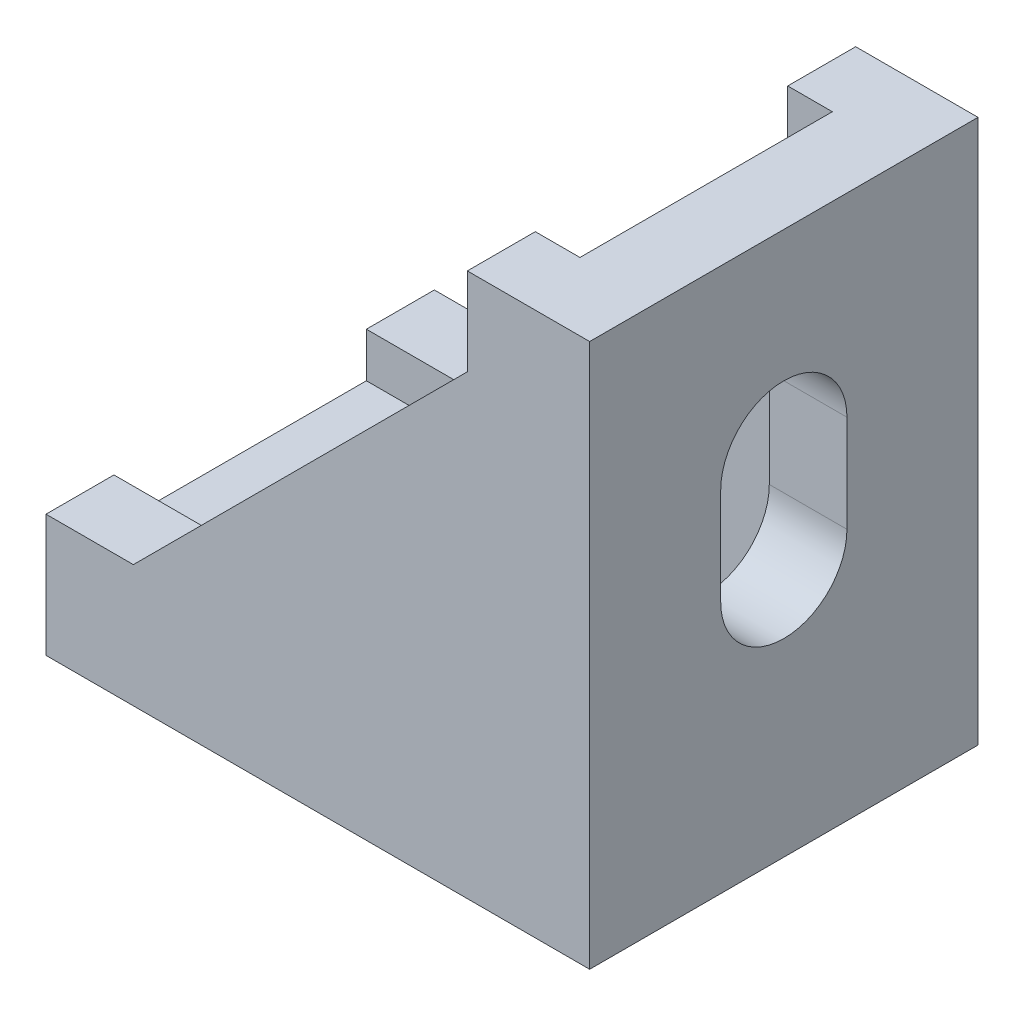
ISO-10303-21;
HEADER;
FILE_DESCRIPTION(('STEP AP214'),'2;1');
FILE_NAME('part.step','',(''),(''),'','','');
FILE_SCHEMA(('AUTOMOTIVE_DESIGN { 1 0 10303 214 1 1 1 1 }'));
ENDSEC;
DATA;
#1=APPLICATION_CONTEXT('core data for automotive mechanical design processes');
#2=APPLICATION_PROTOCOL_DEFINITION('international standard','automotive_design',2000,#1);
#3=PRODUCT_CONTEXT('',#1,'mechanical');
#4=PRODUCT('Part','Part','',(#3));
#5=PRODUCT_RELATED_PRODUCT_CATEGORY('part','',(#4));
#6=PRODUCT_DEFINITION_FORMATION('','',#4);
#7=PRODUCT_DEFINITION_CONTEXT('part definition',#1,'design');
#8=PRODUCT_DEFINITION('design','',#6,#7);
#9=PRODUCT_DEFINITION_SHAPE('','',#8);
#10=(LENGTH_UNIT() NAMED_UNIT(*) SI_UNIT(.MILLI.,.METRE.));
#11=(NAMED_UNIT(*) PLANE_ANGLE_UNIT() SI_UNIT($,.RADIAN.));
#12=(NAMED_UNIT(*) SI_UNIT($,.STERADIAN.) SOLID_ANGLE_UNIT());
#13=UNCERTAINTY_MEASURE_WITH_UNIT(LENGTH_MEASURE(1.E-05),#10,'distance_accuracy_value','');
#14=(GEOMETRIC_REPRESENTATION_CONTEXT(3) GLOBAL_UNCERTAINTY_ASSIGNED_CONTEXT((#13)) GLOBAL_UNIT_ASSIGNED_CONTEXT((#10,
#11,#12)) REPRESENTATION_CONTEXT('',''));
#15=CARTESIAN_POINT('',(0.,0.,0.));
#16=DIRECTION('',(0.,0.,1.));
#17=DIRECTION('',(1.,0.,0.));
#18=AXIS2_PLACEMENT_3D('',#15,#16,#17);
#19=CARTESIAN_POINT('',(10.,14.,20.));
#20=DIRECTION('',(1.,0.,0.));
#21=DIRECTION('',(0.,1.,0.));
#22=AXIS2_PLACEMENT_3D('',#19,#20,#21);
#23=PLANE('',#22);
#24=DIRECTION('',(0.,-1.,0.));
#25=VECTOR('',#24,1.);
#26=CARTESIAN_POINT('',(10.,4.00000000000001,6.75));
#27=LINE('',#26,#25);
#28=CARTESIAN_POINT('',(10.,4.00000000000001,6.75));
#29=VERTEX_POINT('',#28);
#30=CARTESIAN_POINT('',(10.,-0.999999999999995,6.75));
#31=VERTEX_POINT('',#30);
#32=EDGE_CURVE('E257',#29,#31,#27,.T.);
#33=ORIENTED_EDGE('',*,*,#32,.F.);
#34=CARTESIAN_POINT('',(10.,4.,10.));
#35=DIRECTION('',(-1.,0.,0.));
#36=DIRECTION('',(0.,-1.,0.));
#37=AXIS2_PLACEMENT_3D('',#34,#35,#36);
#38=CIRCLE('',#37,3.25);
#39=CARTESIAN_POINT('',(10.,4.,13.25));
#40=VERTEX_POINT('',#39);
#41=EDGE_CURVE('E231',#40,#29,#38,.T.);
#42=ORIENTED_EDGE('',*,*,#41,.F.);
#43=DIRECTION('',(0.,1.,0.));
#44=VECTOR('',#43,1.);
#45=CARTESIAN_POINT('',(10.,4.,13.25));
#46=LINE('',#45,#44);
#47=CARTESIAN_POINT('',(10.,-0.999999999999995,13.25));
#48=VERTEX_POINT('',#47);
#49=EDGE_CURVE('E242',#48,#40,#46,.T.);
#50=ORIENTED_EDGE('',*,*,#49,.F.);
#51=CARTESIAN_POINT('',(10.,-0.999999999999996,10.));
#52=DIRECTION('',(-1.,0.,0.));
#53=DIRECTION('',(0.,-1.,0.));
#54=AXIS2_PLACEMENT_3D('',#51,#52,#53);
#55=CIRCLE('',#54,3.25);
#56=EDGE_CURVE('E261',#31,#48,#55,.T.);
#57=ORIENTED_EDGE('',*,*,#56,.F.);
#58=EDGE_LOOP('',(#33,#42,#50,#57));
#59=FACE_BOUND('',#58,.T.);
#60=DIRECTION('',(0.,-1.,0.));
#61=VECTOR('',#60,1.);
#62=CARTESIAN_POINT('',(10.,14.,16.5));
#63=LINE('',#62,#61);
#64=CARTESIAN_POINT('',(10.,14.,16.5));
#65=VERTEX_POINT('',#64);
#66=CARTESIAN_POINT('',(10.,-10.,16.5));
#67=VERTEX_POINT('',#66);
#68=EDGE_CURVE('E325',#65,#67,#63,.T.);
#69=ORIENTED_EDGE('',*,*,#68,.F.);
#70=DIRECTION('',(0.,0.,-1.));
#71=VECTOR('',#70,1.);
#72=CARTESIAN_POINT('',(10.,14.,20.));
#73=LINE('',#72,#71);
#74=CARTESIAN_POINT('',(10.,14.,3.5));
#75=VERTEX_POINT('',#74);
#76=EDGE_CURVE('E48',#65,#75,#73,.T.);
#77=ORIENTED_EDGE('',*,*,#76,.T.);
#78=DIRECTION('',(0.,1.,0.));
#79=VECTOR('',#78,1.);
#80=CARTESIAN_POINT('',(10.,14.,3.5));
#81=LINE('',#80,#79);
#82=CARTESIAN_POINT('',(10.,-10.,3.5));
#83=VERTEX_POINT('',#82);
#84=EDGE_CURVE('E377',#83,#75,#81,.T.);
#85=ORIENTED_EDGE('',*,*,#84,.F.);
#86=DIRECTION('',(0.,0.,-1.));
#87=VECTOR('',#86,1.);
#88=CARTESIAN_POINT('',(10.,-10.,20.));
#89=LINE('',#88,#87);
#90=EDGE_CURVE('E418',#67,#83,#89,.T.);
#91=ORIENTED_EDGE('',*,*,#90,.F.);
#92=EDGE_LOOP('',(#69,#77,#85,#91));
#93=FACE_BOUND('',#92,.T.);
#94=ADVANCED_FACE('F39',(#59,#93),#23,.F.);
#95=CARTESIAN_POINT('',(10.,-10.,20.));
#96=DIRECTION('',(0.,-1.,0.));
#97=DIRECTION('',(1.,0.,0.));
#98=AXIS2_PLACEMENT_3D('',#95,#96,#97);
#99=PLANE('',#98);
#100=DIRECTION('',(1.,0.,0.));
#101=VECTOR('',#100,1.);
#102=CARTESIAN_POINT('',(-3.99999999999999,-10.,13.25));
#103=LINE('',#102,#101);
#104=CARTESIAN_POINT('',(-3.99999999999999,-10.,13.25));
#105=VERTEX_POINT('',#104);
#106=CARTESIAN_POINT('',(1.,-10.,13.25));
#107=VERTEX_POINT('',#106);
#108=EDGE_CURVE('E222',#105,#107,#103,.T.);
#109=ORIENTED_EDGE('',*,*,#108,.F.);
#110=CARTESIAN_POINT('',(-3.99999999999999,-10.,10.));
#111=DIRECTION('',(0.,1.,0.));
#112=DIRECTION('',(-1.,0.,0.));
#113=AXIS2_PLACEMENT_3D('',#110,#111,#112);
#114=CIRCLE('',#113,3.25);
#115=CARTESIAN_POINT('',(-3.99999999999999,-10.,6.75));
#116=VERTEX_POINT('',#115);
#117=EDGE_CURVE('E55',#116,#105,#114,.T.);
#118=ORIENTED_EDGE('',*,*,#117,.F.);
#119=DIRECTION('',(-1.,0.,0.));
#120=VECTOR('',#119,1.);
#121=CARTESIAN_POINT('',(-3.99999999999999,-10.,6.75));
#122=LINE('',#121,#120);
#123=CARTESIAN_POINT('',(1.00000000000001,-10.,6.75));
#124=VERTEX_POINT('',#123);
#125=EDGE_CURVE('E209',#124,#116,#122,.T.);
#126=ORIENTED_EDGE('',*,*,#125,.F.);
#127=CARTESIAN_POINT('',(1.00000000000001,-10.,10.));
#128=DIRECTION('',(0.,1.,0.));
#129=DIRECTION('',(-1.,0.,0.));
#130=AXIS2_PLACEMENT_3D('',#127,#128,#129);
#131=CIRCLE('',#130,3.25);
#132=EDGE_CURVE('E213',#107,#124,#131,.T.);
#133=ORIENTED_EDGE('',*,*,#132,.F.);
#134=EDGE_LOOP('',(#109,#118,#126,#133));
#135=FACE_BOUND('',#134,.T.);
#136=DIRECTION('',(-1.,0.,0.));
#137=VECTOR('',#136,1.);
#138=CARTESIAN_POINT('',(10.,-10.,16.5));
#139=LINE('',#138,#137);
#140=CARTESIAN_POINT('',(-14.,-10.,16.5));
#141=VERTEX_POINT('',#140);
#142=EDGE_CURVE('E311',#67,#141,#139,.T.);
#143=ORIENTED_EDGE('',*,*,#142,.F.);
#144=ORIENTED_EDGE('',*,*,#90,.T.);
#145=DIRECTION('',(1.,0.,0.));
#146=VECTOR('',#145,1.);
#147=CARTESIAN_POINT('',(10.,-10.,3.5));
#148=LINE('',#147,#146);
#149=CARTESIAN_POINT('',(-14.,-10.,3.5));
#150=VERTEX_POINT('',#149);
#151=EDGE_CURVE('E364',#150,#83,#148,.T.);
#152=ORIENTED_EDGE('',*,*,#151,.F.);
#153=DIRECTION('',(0.,0.,-1.));
#154=VECTOR('',#153,1.);
#155=CARTESIAN_POINT('',(-14.,-10.,20.));
#156=LINE('',#155,#154);
#157=EDGE_CURVE('E415',#141,#150,#156,.T.);
#158=ORIENTED_EDGE('',*,*,#157,.F.);
#159=EDGE_LOOP('',(#143,#144,#152,#158));
#160=FACE_BOUND('',#159,.T.);
#161=ADVANCED_FACE('F454',(#135,#160),#99,.F.);
#162=CARTESIAN_POINT('',(14.,-14.,20.));
#163=DIRECTION('',(-1.,0.,0.));
#164=DIRECTION('',(0.,0.,1.));
#165=AXIS2_PLACEMENT_3D('',#162,#163,#164);
#166=PLANE('',#165);
#167=DIRECTION('',(0.,1.,0.));
#168=VECTOR('',#167,1.);
#169=CARTESIAN_POINT('',(14.,4.,13.25));
#170=LINE('',#169,#168);
#171=CARTESIAN_POINT('',(14.,-0.999999999999994,13.25));
#172=VERTEX_POINT('',#171);
#173=CARTESIAN_POINT('',(14.,4.,13.25));
#174=VERTEX_POINT('',#173);
#175=EDGE_CURVE('E250',#172,#174,#170,.T.);
#176=ORIENTED_EDGE('',*,*,#175,.T.);
#177=CARTESIAN_POINT('',(14.,4.00000000000001,10.));
#178=DIRECTION('',(-1.,0.,0.));
#179=DIRECTION('',(0.,-1.,0.));
#180=AXIS2_PLACEMENT_3D('',#177,#178,#179);
#181=CIRCLE('',#180,3.25);
#182=CARTESIAN_POINT('',(14.,4.00000000000001,6.75));
#183=VERTEX_POINT('',#182);
#184=EDGE_CURVE('E237',#174,#183,#181,.T.);
#185=ORIENTED_EDGE('',*,*,#184,.T.);
#186=DIRECTION('',(0.,-1.,0.));
#187=VECTOR('',#186,1.);
#188=CARTESIAN_POINT('',(14.,4.00000000000001,6.75));
#189=LINE('',#188,#187);
#190=CARTESIAN_POINT('',(14.,-0.999999999999996,6.75));
#191=VERTEX_POINT('',#190);
#192=EDGE_CURVE('E241',#183,#191,#189,.T.);
#193=ORIENTED_EDGE('',*,*,#192,.T.);
#194=CARTESIAN_POINT('',(14.,-0.999999999999995,10.));
#195=DIRECTION('',(-1.,0.,0.));
#196=DIRECTION('',(0.,-1.,0.));
#197=AXIS2_PLACEMENT_3D('',#194,#195,#196);
#198=CIRCLE('',#197,3.25);
#199=EDGE_CURVE('E246',#191,#172,#198,.T.);
#200=ORIENTED_EDGE('',*,*,#199,.T.);
#201=EDGE_LOOP('',(#176,#185,#193,#200));
#202=FACE_BOUND('',#201,.T.);
#203=DIRECTION('',(0.,0.,-1.));
#204=VECTOR('',#203,1.);
#205=CARTESIAN_POINT('',(14.,-14.,20.));
#206=LINE('',#205,#204);
#207=CARTESIAN_POINT('',(14.,-14.,20.));
#208=VERTEX_POINT('',#207);
#209=CARTESIAN_POINT('',(14.,-14.,0.));
#210=VERTEX_POINT('',#209);
#211=EDGE_CURVE('E396',#208,#210,#206,.T.);
#212=ORIENTED_EDGE('',*,*,#211,.T.);
#213=DIRECTION('',(0.,1.,0.));
#214=VECTOR('',#213,1.);
#215=CARTESIAN_POINT('',(14.,-14.,0.));
#216=LINE('',#215,#214);
#217=CARTESIAN_POINT('',(14.,14.,0.));
#218=VERTEX_POINT('',#217);
#219=EDGE_CURVE('E381',#210,#218,#216,.T.);
#220=ORIENTED_EDGE('',*,*,#219,.T.);
#221=DIRECTION('',(0.,0.,-1.));
#222=VECTOR('',#221,1.);
#223=CARTESIAN_POINT('',(14.,14.,20.));
#224=LINE('',#223,#222);
#225=CARTESIAN_POINT('',(14.,14.,20.));
#226=VERTEX_POINT('',#225);
#227=EDGE_CURVE('E11',#226,#218,#224,.T.);
#228=ORIENTED_EDGE('',*,*,#227,.F.);
#229=DIRECTION('',(0.,1.,0.));
#230=VECTOR('',#229,1.);
#231=CARTESIAN_POINT('',(14.,-14.,20.));
#232=LINE('',#231,#230);
#233=EDGE_CURVE('E382',#208,#226,#232,.T.);
#234=ORIENTED_EDGE('',*,*,#233,.F.);
#235=EDGE_LOOP('',(#212,#220,#228,#234));
#236=FACE_BOUND('',#235,.T.);
#237=ADVANCED_FACE('F41',(#202,#236),#166,.F.);
#238=CARTESIAN_POINT('',(14.,14.,20.));
#239=DIRECTION('',(0.,-1.,0.));
#240=DIRECTION('',(1.,0.,0.));
#241=AXIS2_PLACEMENT_3D('',#238,#239,#240);
#242=PLANE('',#241);
#243=ORIENTED_EDGE('',*,*,#227,.T.);
#244=DIRECTION('',(-1.,0.,0.));
#245=VECTOR('',#244,1.);
#246=CARTESIAN_POINT('',(14.,14.,0.));
#247=LINE('',#246,#245);
#248=CARTESIAN_POINT('',(7.7,14.,0.));
#249=VERTEX_POINT('',#248);
#250=EDGE_CURVE('E400',#218,#249,#247,.T.);
#251=ORIENTED_EDGE('',*,*,#250,.T.);
#252=DIRECTION('',(0.,0.,-1.));
#253=VECTOR('',#252,1.);
#254=CARTESIAN_POINT('',(7.7,14.,3.5));
#255=LINE('',#254,#253);
#256=CARTESIAN_POINT('',(7.7,14.,3.5));
#257=VERTEX_POINT('',#256);
#258=EDGE_CURVE('E360',#257,#249,#255,.T.);
#259=ORIENTED_EDGE('',*,*,#258,.F.);
#260=DIRECTION('',(1.,0.,0.));
#261=VECTOR('',#260,1.);
#262=CARTESIAN_POINT('',(10.,14.,3.5));
#263=LINE('',#262,#261);
#264=EDGE_CURVE('E329',#257,#75,#263,.T.);
#265=ORIENTED_EDGE('',*,*,#264,.T.);
#266=ORIENTED_EDGE('',*,*,#76,.F.);
#267=DIRECTION('',(1.,0.,0.));
#268=VECTOR('',#267,1.);
#269=CARTESIAN_POINT('',(10.,14.,16.5));
#270=LINE('',#269,#268);
#271=CARTESIAN_POINT('',(7.7,14.,16.5));
#272=VERTEX_POINT('',#271);
#273=EDGE_CURVE('E281',#272,#65,#270,.T.);
#274=ORIENTED_EDGE('',*,*,#273,.F.);
#275=DIRECTION('',(0.,0.,1.));
#276=VECTOR('',#275,1.);
#277=CARTESIAN_POINT('',(7.7,14.,16.5));
#278=LINE('',#277,#276);
#279=CARTESIAN_POINT('',(7.7,14.,20.));
#280=VERTEX_POINT('',#279);
#281=EDGE_CURVE('E298',#272,#280,#278,.T.);
#282=ORIENTED_EDGE('',*,*,#281,.T.);
#283=DIRECTION('',(-1.,0.,0.));
#284=VECTOR('',#283,1.);
#285=CARTESIAN_POINT('',(14.,14.,20.));
#286=LINE('',#285,#284);
#287=EDGE_CURVE('E386',#226,#280,#286,.T.);
#288=ORIENTED_EDGE('',*,*,#287,.F.);
#289=EDGE_LOOP('',(#243,#251,#259,#265,#266,#274,#282,#288));
#290=FACE_BOUND('',#289,.T.);
#291=ADVANCED_FACE('F433',(#290),#242,.F.);
#292=CARTESIAN_POINT('',(-14.,-14.,20.));
#293=DIRECTION('',(1.,0.,0.));
#294=DIRECTION('',(0.,0.,-1.));
#295=AXIS2_PLACEMENT_3D('',#292,#293,#294);
#296=PLANE('',#295);
#297=DIRECTION('',(0.,-1.,0.));
#298=VECTOR('',#297,1.);
#299=CARTESIAN_POINT('',(-14.,-14.,20.));
#300=LINE('',#299,#298);
#301=CARTESIAN_POINT('',(-14.,-7.7,20.));
#302=VERTEX_POINT('',#301);
#303=CARTESIAN_POINT('',(-14.,-14.,20.));
#304=VERTEX_POINT('',#303);
#305=EDGE_CURVE('E390',#302,#304,#300,.T.);
#306=ORIENTED_EDGE('',*,*,#305,.F.);
#307=DIRECTION('',(0.,0.,1.));
#308=VECTOR('',#307,1.);
#309=CARTESIAN_POINT('',(-14.,-7.7,16.5));
#310=LINE('',#309,#308);
#311=CARTESIAN_POINT('',(-14.,-7.7,16.5));
#312=VERTEX_POINT('',#311);
#313=EDGE_CURVE('E307',#312,#302,#310,.T.);
#314=ORIENTED_EDGE('',*,*,#313,.F.);
#315=DIRECTION('',(0.,1.,0.));
#316=VECTOR('',#315,1.);
#317=CARTESIAN_POINT('',(-14.,-7.7,16.5));
#318=LINE('',#317,#316);
#319=EDGE_CURVE('E295',#141,#312,#318,.T.);
#320=ORIENTED_EDGE('',*,*,#319,.F.);
#321=ORIENTED_EDGE('',*,*,#157,.T.);
#322=DIRECTION('',(0.,1.,0.));
#323=VECTOR('',#322,1.);
#324=CARTESIAN_POINT('',(-14.,-14.,3.5));
#325=LINE('',#324,#323);
#326=CARTESIAN_POINT('',(-14.,-7.7,3.5));
#327=VERTEX_POINT('',#326);
#328=EDGE_CURVE('E333',#150,#327,#325,.T.);
#329=ORIENTED_EDGE('',*,*,#328,.T.);
#330=DIRECTION('',(0.,0.,-1.));
#331=VECTOR('',#330,1.);
#332=CARTESIAN_POINT('',(-14.,-7.7,3.5));
#333=LINE('',#332,#331);
#334=CARTESIAN_POINT('',(-14.,-7.7,0.));
#335=VERTEX_POINT('',#334);
#336=EDGE_CURVE('E349',#327,#335,#333,.T.);
#337=ORIENTED_EDGE('',*,*,#336,.T.);
#338=DIRECTION('',(0.,-1.,0.));
#339=VECTOR('',#338,1.);
#340=CARTESIAN_POINT('',(-14.,-14.,0.));
#341=LINE('',#340,#339);
#342=CARTESIAN_POINT('',(-14.,-14.,0.));
#343=VERTEX_POINT('',#342);
#344=EDGE_CURVE('E403',#335,#343,#341,.T.);
#345=ORIENTED_EDGE('',*,*,#344,.T.);
#346=DIRECTION('',(0.,0.,-1.));
#347=VECTOR('',#346,1.);
#348=CARTESIAN_POINT('',(-14.,-14.,20.));
#349=LINE('',#348,#347);
#350=EDGE_CURVE('E412',#304,#343,#349,.T.);
#351=ORIENTED_EDGE('',*,*,#350,.F.);
#352=EDGE_LOOP('',(#306,#314,#320,#321,#329,#337,#345,#351));
#353=FACE_BOUND('',#352,.T.);
#354=ADVANCED_FACE('F448',(#353),#296,.F.);
#355=CARTESIAN_POINT('',(14.,-14.,20.));
#356=DIRECTION('',(0.,1.,0.));
#357=DIRECTION('',(0.,0.,1.));
#358=AXIS2_PLACEMENT_3D('',#355,#356,#357);
#359=PLANE('',#358);
#360=DIRECTION('',(-1.,0.,0.));
#361=VECTOR('',#360,1.);
#362=CARTESIAN_POINT('',(-3.99999999999999,-14.,6.75));
#363=LINE('',#362,#361);
#364=CARTESIAN_POINT('',(1.00000000000001,-14.,6.75));
#365=VERTEX_POINT('',#364);
#366=CARTESIAN_POINT('',(-3.99999999999999,-14.,6.75));
#367=VERTEX_POINT('',#366);
#368=EDGE_CURVE('E197',#365,#367,#363,.T.);
#369=ORIENTED_EDGE('',*,*,#368,.T.);
#370=CARTESIAN_POINT('',(-3.99999999999999,-14.,10.));
#371=DIRECTION('',(0.,1.,0.));
#372=DIRECTION('',(-1.,0.,0.));
#373=AXIS2_PLACEMENT_3D('',#370,#371,#372);
#374=CIRCLE('',#373,3.25);
#375=CARTESIAN_POINT('',(-3.99999999999999,-14.,13.25));
#376=VERTEX_POINT('',#375);
#377=EDGE_CURVE('E190',#367,#376,#374,.T.);
#378=ORIENTED_EDGE('',*,*,#377,.T.);
#379=DIRECTION('',(1.,0.,0.));
#380=VECTOR('',#379,1.);
#381=CARTESIAN_POINT('',(-3.99999999999999,-14.,13.25));
#382=LINE('',#381,#380);
#383=CARTESIAN_POINT('',(1.,-14.,13.25));
#384=VERTEX_POINT('',#383);
#385=EDGE_CURVE('E200',#376,#384,#382,.T.);
#386=ORIENTED_EDGE('',*,*,#385,.T.);
#387=CARTESIAN_POINT('',(1.00000000000001,-14.,10.));
#388=DIRECTION('',(0.,1.,0.));
#389=DIRECTION('',(-1.,0.,0.));
#390=AXIS2_PLACEMENT_3D('',#387,#388,#389);
#391=CIRCLE('',#390,3.25);
#392=EDGE_CURVE('E63',#384,#365,#391,.T.);
#393=ORIENTED_EDGE('',*,*,#392,.T.);
#394=EDGE_LOOP('',(#369,#378,#386,#393));
#395=FACE_BOUND('',#394,.T.);
#396=ORIENTED_EDGE('',*,*,#350,.T.);
#397=DIRECTION('',(1.,0.,0.));
#398=VECTOR('',#397,1.);
#399=CARTESIAN_POINT('',(14.,-14.,0.));
#400=LINE('',#399,#398);
#401=EDGE_CURVE('E387',#343,#210,#400,.T.);
#402=ORIENTED_EDGE('',*,*,#401,.T.);
#403=ORIENTED_EDGE('',*,*,#211,.F.);
#404=DIRECTION('',(1.,0.,0.));
#405=VECTOR('',#404,1.);
#406=CARTESIAN_POINT('',(14.,-14.,20.));
#407=LINE('',#406,#405);
#408=EDGE_CURVE('E393',#304,#208,#407,.T.);
#409=ORIENTED_EDGE('',*,*,#408,.F.);
#410=EDGE_LOOP('',(#396,#402,#403,#409));
#411=FACE_BOUND('',#410,.T.);
#412=ADVANCED_FACE('F205',(#395,#411),#359,.F.);
#413=CARTESIAN_POINT('',(0.,0.,20.));
#414=DIRECTION('',(0.,0.,1.));
#415=DIRECTION('',(1.,0.,0.));
#416=AXIS2_PLACEMENT_3D('',#413,#414,#415);
#417=PLANE('',#416);
#418=ORIENTED_EDGE('',*,*,#233,.T.);
#419=ORIENTED_EDGE('',*,*,#287,.T.);
#420=DIRECTION('',(0.,1.,0.));
#421=VECTOR('',#420,1.);
#422=CARTESIAN_POINT('',(7.7,14.,20.));
#423=LINE('',#422,#421);
#424=CARTESIAN_POINT('',(7.7,9.49999999999999,20.));
#425=VERTEX_POINT('',#424);
#426=EDGE_CURVE('E271',#425,#280,#423,.T.);
#427=ORIENTED_EDGE('',*,*,#426,.F.);
#428=DIRECTION('',(0.707106781186548,0.707106781186547,0.));
#429=VECTOR('',#428,1.);
#430=CARTESIAN_POINT('',(7.7,9.49999999999999,20.));
#431=LINE('',#430,#429);
#432=CARTESIAN_POINT('',(-9.5,-7.7,20.));
#433=VERTEX_POINT('',#432);
#434=EDGE_CURVE('E302',#433,#425,#431,.T.);
#435=ORIENTED_EDGE('',*,*,#434,.F.);
#436=DIRECTION('',(1.,0.,0.));
#437=VECTOR('',#436,1.);
#438=CARTESIAN_POINT('',(-9.5,-7.7,20.));
#439=LINE('',#438,#437);
#440=EDGE_CURVE('E285',#302,#433,#439,.T.);
#441=ORIENTED_EDGE('',*,*,#440,.F.);
#442=ORIENTED_EDGE('',*,*,#305,.T.);
#443=ORIENTED_EDGE('',*,*,#408,.T.);
#444=EDGE_LOOP('',(#418,#419,#427,#435,#441,#442,#443));
#445=FACE_BOUND('',#444,.T.);
#446=ADVANCED_FACE('F465',(#445),#417,.T.);
#447=CARTESIAN_POINT('',(0.,0.,0.));
#448=DIRECTION('',(0.,0.,1.));
#449=DIRECTION('',(1.,0.,0.));
#450=AXIS2_PLACEMENT_3D('',#447,#448,#449);
#451=PLANE('',#450);
#452=ORIENTED_EDGE('',*,*,#219,.F.);
#453=ORIENTED_EDGE('',*,*,#401,.F.);
#454=ORIENTED_EDGE('',*,*,#344,.F.);
#455=DIRECTION('',(1.,0.,0.));
#456=VECTOR('',#455,1.);
#457=CARTESIAN_POINT('',(-9.5,-7.7,0.));
#458=LINE('',#457,#456);
#459=CARTESIAN_POINT('',(-9.5,-7.7,0.));
#460=VERTEX_POINT('',#459);
#461=EDGE_CURVE('E328',#335,#460,#458,.T.);
#462=ORIENTED_EDGE('',*,*,#461,.T.);
#463=DIRECTION('',(0.707106781186548,0.707106781186547,0.));
#464=VECTOR('',#463,1.);
#465=CARTESIAN_POINT('',(7.7,9.49999999999999,0.));
#466=LINE('',#465,#464);
#467=CARTESIAN_POINT('',(7.7,9.49999999999999,0.));
#468=VERTEX_POINT('',#467);
#469=EDGE_CURVE('E353',#460,#468,#466,.T.);
#470=ORIENTED_EDGE('',*,*,#469,.T.);
#471=DIRECTION('',(0.,1.,0.));
#472=VECTOR('',#471,1.);
#473=CARTESIAN_POINT('',(7.7,14.,0.));
#474=LINE('',#473,#472);
#475=EDGE_CURVE('E334',#468,#249,#474,.T.);
#476=ORIENTED_EDGE('',*,*,#475,.T.);
#477=ORIENTED_EDGE('',*,*,#250,.F.);
#478=EDGE_LOOP('',(#452,#453,#454,#462,#470,#476,#477));
#479=FACE_BOUND('',#478,.T.);
#480=ADVANCED_FACE('F474',(#479),#451,.F.);
#481=CARTESIAN_POINT('',(0.,0.,3.5));
#482=DIRECTION('',(0.,0.,-1.));
#483=DIRECTION('',(-1.,0.,0.));
#484=AXIS2_PLACEMENT_3D('',#481,#482,#483);
#485=PLANE('',#484);
#486=ORIENTED_EDGE('',*,*,#151,.T.);
#487=ORIENTED_EDGE('',*,*,#84,.T.);
#488=ORIENTED_EDGE('',*,*,#264,.F.);
#489=DIRECTION('',(0.,1.,0.));
#490=VECTOR('',#489,1.);
#491=CARTESIAN_POINT('',(7.7,14.,3.5));
#492=LINE('',#491,#490);
#493=CARTESIAN_POINT('',(7.7,9.49999999999999,3.5));
#494=VERTEX_POINT('',#493);
#495=EDGE_CURVE('E345',#494,#257,#492,.T.);
#496=ORIENTED_EDGE('',*,*,#495,.F.);
#497=DIRECTION('',(0.707106781186548,0.707106781186547,0.));
#498=VECTOR('',#497,1.);
#499=CARTESIAN_POINT('',(7.7,9.49999999999999,3.5));
#500=LINE('',#499,#498);
#501=CARTESIAN_POINT('',(-9.5,-7.7,3.5));
#502=VERTEX_POINT('',#501);
#503=EDGE_CURVE('E341',#502,#494,#500,.T.);
#504=ORIENTED_EDGE('',*,*,#503,.F.);
#505=DIRECTION('',(1.,0.,0.));
#506=VECTOR('',#505,1.);
#507=CARTESIAN_POINT('',(-9.5,-7.7,3.5));
#508=LINE('',#507,#506);
#509=EDGE_CURVE('E337',#327,#502,#508,.T.);
#510=ORIENTED_EDGE('',*,*,#509,.F.);
#511=ORIENTED_EDGE('',*,*,#328,.F.);
#512=EDGE_LOOP('',(#486,#487,#488,#496,#504,#510,#511));
#513=FACE_BOUND('',#512,.T.);
#514=ADVANCED_FACE('F428',(#513),#485,.F.);
#515=CARTESIAN_POINT('',(7.7,14.,3.5));
#516=DIRECTION('',(-1.,0.,0.));
#517=DIRECTION('',(0.,-1.,0.));
#518=AXIS2_PLACEMENT_3D('',#515,#516,#517);
#519=PLANE('',#518);
#520=ORIENTED_EDGE('',*,*,#475,.F.);
#521=DIRECTION('',(0.,0.,-1.));
#522=VECTOR('',#521,1.);
#523=CARTESIAN_POINT('',(7.7,9.49999999999999,3.5));
#524=LINE('',#523,#522);
#525=EDGE_CURVE('E365',#494,#468,#524,.T.);
#526=ORIENTED_EDGE('',*,*,#525,.F.);
#527=ORIENTED_EDGE('',*,*,#495,.T.);
#528=ORIENTED_EDGE('',*,*,#258,.T.);
#529=EDGE_LOOP('',(#520,#526,#527,#528));
#530=FACE_BOUND('',#529,.T.);
#531=ADVANCED_FACE('F437',(#530),#519,.T.);
#532=CARTESIAN_POINT('',(7.7,9.49999999999999,3.5));
#533=DIRECTION('',(-0.707106781186547,0.707106781186548,0.));
#534=DIRECTION('',(-0.707106781186548,-0.707106781186547,0.));
#535=AXIS2_PLACEMENT_3D('',#532,#533,#534);
#536=PLANE('',#535);
#537=ORIENTED_EDGE('',*,*,#469,.F.);
#538=DIRECTION('',(0.,0.,-1.));
#539=VECTOR('',#538,1.);
#540=CARTESIAN_POINT('',(-9.5,-7.7,3.5));
#541=LINE('',#540,#539);
#542=EDGE_CURVE('E368',#502,#460,#541,.T.);
#543=ORIENTED_EDGE('',*,*,#542,.F.);
#544=ORIENTED_EDGE('',*,*,#503,.T.);
#545=ORIENTED_EDGE('',*,*,#525,.T.);
#546=EDGE_LOOP('',(#537,#543,#544,#545));
#547=FACE_BOUND('',#546,.T.);
#548=ADVANCED_FACE('F442',(#547),#536,.T.);
#549=CARTESIAN_POINT('',(-9.5,-7.7,3.5));
#550=DIRECTION('',(0.,1.,0.));
#551=DIRECTION('',(0.,0.,1.));
#552=AXIS2_PLACEMENT_3D('',#549,#550,#551);
#553=PLANE('',#552);
#554=ORIENTED_EDGE('',*,*,#461,.F.);
#555=ORIENTED_EDGE('',*,*,#336,.F.);
#556=ORIENTED_EDGE('',*,*,#509,.T.);
#557=ORIENTED_EDGE('',*,*,#542,.T.);
#558=EDGE_LOOP('',(#554,#555,#556,#557));
#559=FACE_BOUND('',#558,.T.);
#560=ADVANCED_FACE('F445',(#559),#553,.T.);
#561=CARTESIAN_POINT('',(0.,0.,16.5));
#562=DIRECTION('',(0.,0.,1.));
#563=DIRECTION('',(-1.,0.,0.));
#564=AXIS2_PLACEMENT_3D('',#561,#562,#563);
#565=PLANE('',#564);
#566=ORIENTED_EDGE('',*,*,#273,.T.);
#567=ORIENTED_EDGE('',*,*,#68,.T.);
#568=ORIENTED_EDGE('',*,*,#142,.T.);
#569=ORIENTED_EDGE('',*,*,#319,.T.);
#570=DIRECTION('',(1.,0.,0.));
#571=VECTOR('',#570,1.);
#572=CARTESIAN_POINT('',(-9.5,-7.7,16.5));
#573=LINE('',#572,#571);
#574=CARTESIAN_POINT('',(-9.5,-7.7,16.5));
#575=VERTEX_POINT('',#574);
#576=EDGE_CURVE('E292',#312,#575,#573,.T.);
#577=ORIENTED_EDGE('',*,*,#576,.T.);
#578=DIRECTION('',(0.707106781186548,0.707106781186547,0.));
#579=VECTOR('',#578,1.);
#580=CARTESIAN_POINT('',(7.7,9.49999999999999,16.5));
#581=LINE('',#580,#579);
#582=CARTESIAN_POINT('',(7.7,9.49999999999999,16.5));
#583=VERTEX_POINT('',#582);
#584=EDGE_CURVE('E289',#575,#583,#581,.T.);
#585=ORIENTED_EDGE('',*,*,#584,.T.);
#586=DIRECTION('',(0.,1.,0.));
#587=VECTOR('',#586,1.);
#588=CARTESIAN_POINT('',(7.7,14.,16.5));
#589=LINE('',#588,#587);
#590=EDGE_CURVE('E284',#583,#272,#589,.T.);
#591=ORIENTED_EDGE('',*,*,#590,.T.);
#592=EDGE_LOOP('',(#566,#567,#568,#569,#577,#585,#591));
#593=FACE_BOUND('',#592,.T.);
#594=ADVANCED_FACE('F456',(#593),#565,.F.);
#595=CARTESIAN_POINT('',(-9.5,-7.7,16.5));
#596=DIRECTION('',(0.,-1.,0.));
#597=DIRECTION('',(0.,0.,-1.));
#598=AXIS2_PLACEMENT_3D('',#595,#596,#597);
#599=PLANE('',#598);
#600=ORIENTED_EDGE('',*,*,#440,.T.);
#601=DIRECTION('',(0.,0.,1.));
#602=VECTOR('',#601,1.);
#603=CARTESIAN_POINT('',(-9.5,-7.7,16.5));
#604=LINE('',#603,#602);
#605=EDGE_CURVE('E312',#575,#433,#604,.T.);
#606=ORIENTED_EDGE('',*,*,#605,.F.);
#607=ORIENTED_EDGE('',*,*,#576,.F.);
#608=ORIENTED_EDGE('',*,*,#313,.T.);
#609=EDGE_LOOP('',(#600,#606,#607,#608));
#610=FACE_BOUND('',#609,.T.);
#611=ADVANCED_FACE('F531',(#610),#599,.F.);
#612=CARTESIAN_POINT('',(7.7,9.49999999999999,16.5));
#613=DIRECTION('',(0.707106781186547,-0.707106781186548,0.));
#614=DIRECTION('',(0.707106781186548,0.707106781186547,0.));
#615=AXIS2_PLACEMENT_3D('',#612,#613,#614);
#616=PLANE('',#615);
#617=ORIENTED_EDGE('',*,*,#434,.T.);
#618=DIRECTION('',(0.,0.,1.));
#619=VECTOR('',#618,1.);
#620=CARTESIAN_POINT('',(7.7,9.49999999999999,16.5));
#621=LINE('',#620,#619);
#622=EDGE_CURVE('E316',#583,#425,#621,.T.);
#623=ORIENTED_EDGE('',*,*,#622,.F.);
#624=ORIENTED_EDGE('',*,*,#584,.F.);
#625=ORIENTED_EDGE('',*,*,#605,.T.);
#626=EDGE_LOOP('',(#617,#623,#624,#625));
#627=FACE_BOUND('',#626,.T.);
#628=ADVANCED_FACE('F534',(#627),#616,.F.);
#629=CARTESIAN_POINT('',(7.7,14.,16.5));
#630=DIRECTION('',(1.,0.,0.));
#631=DIRECTION('',(0.,1.,0.));
#632=AXIS2_PLACEMENT_3D('',#629,#630,#631);
#633=PLANE('',#632);
#634=ORIENTED_EDGE('',*,*,#426,.T.);
#635=ORIENTED_EDGE('',*,*,#281,.F.);
#636=ORIENTED_EDGE('',*,*,#590,.F.);
#637=ORIENTED_EDGE('',*,*,#622,.T.);
#638=EDGE_LOOP('',(#634,#635,#636,#637));
#639=FACE_BOUND('',#638,.T.);
#640=ADVANCED_FACE('F460',(#639),#633,.F.);
#641=CARTESIAN_POINT('',(14.,4.00000000000001,10.));
#642=DIRECTION('',(-1.,0.,0.));
#643=DIRECTION('',(0.,-1.,0.));
#644=AXIS2_PLACEMENT_3D('',#641,#642,#643);
#645=CYLINDRICAL_SURFACE('',#644,3.25);
#646=ORIENTED_EDGE('',*,*,#41,.T.);
#647=DIRECTION('',(-1.,0.,0.));
#648=VECTOR('',#647,1.);
#649=CARTESIAN_POINT('',(14.,4.00000000000001,6.75));
#650=LINE('',#649,#648);
#651=EDGE_CURVE('E254',#183,#29,#650,.T.);
#652=ORIENTED_EDGE('',*,*,#651,.F.);
#653=ORIENTED_EDGE('',*,*,#184,.F.);
#654=DIRECTION('',(-1.,0.,0.));
#655=VECTOR('',#654,1.);
#656=CARTESIAN_POINT('',(14.,4.,13.25));
#657=LINE('',#656,#655);
#658=EDGE_CURVE('E268',#174,#40,#657,.T.);
#659=ORIENTED_EDGE('',*,*,#658,.T.);
#660=EDGE_LOOP('',(#646,#652,#653,#659));
#661=FACE_BOUND('',#660,.T.);
#662=ADVANCED_FACE('F509',(#661),#645,.F.);
#663=CARTESIAN_POINT('',(14.,4.,13.25));
#664=DIRECTION('',(0.,0.,1.));
#665=DIRECTION('',(0.,-1.,0.));
#666=AXIS2_PLACEMENT_3D('',#663,#664,#665);
#667=PLANE('',#666);
#668=ORIENTED_EDGE('',*,*,#49,.T.);
#669=ORIENTED_EDGE('',*,*,#658,.F.);
#670=ORIENTED_EDGE('',*,*,#175,.F.);
#671=DIRECTION('',(-1.,0.,0.));
#672=VECTOR('',#671,1.);
#673=CARTESIAN_POINT('',(14.,-0.999999999999994,13.25));
#674=LINE('',#673,#672);
#675=EDGE_CURVE('E272',#172,#48,#674,.T.);
#676=ORIENTED_EDGE('',*,*,#675,.T.);
#677=EDGE_LOOP('',(#668,#669,#670,#676));
#678=FACE_BOUND('',#677,.T.);
#679=ADVANCED_FACE('F505',(#678),#667,.F.);
#680=CARTESIAN_POINT('',(14.,-0.999999999999995,10.));
#681=DIRECTION('',(-1.,0.,0.));
#682=DIRECTION('',(0.,-1.,0.));
#683=AXIS2_PLACEMENT_3D('',#680,#681,#682);
#684=CYLINDRICAL_SURFACE('',#683,3.25);
#685=ORIENTED_EDGE('',*,*,#56,.T.);
#686=ORIENTED_EDGE('',*,*,#675,.F.);
#687=ORIENTED_EDGE('',*,*,#199,.F.);
#688=DIRECTION('',(-1.,0.,0.));
#689=VECTOR('',#688,1.);
#690=CARTESIAN_POINT('',(14.,-0.999999999999995,6.75));
#691=LINE('',#690,#689);
#692=EDGE_CURVE('E275',#191,#31,#691,.T.);
#693=ORIENTED_EDGE('',*,*,#692,.T.);
#694=EDGE_LOOP('',(#685,#686,#687,#693));
#695=FACE_BOUND('',#694,.T.);
#696=ADVANCED_FACE('F516',(#695),#684,.F.);
#697=CARTESIAN_POINT('',(14.,4.00000000000001,6.75));
#698=DIRECTION('',(0.,0.,-1.));
#699=DIRECTION('',(0.,1.,0.));
#700=AXIS2_PLACEMENT_3D('',#697,#698,#699);
#701=PLANE('',#700);
#702=ORIENTED_EDGE('',*,*,#32,.T.);
#703=ORIENTED_EDGE('',*,*,#692,.F.);
#704=ORIENTED_EDGE('',*,*,#192,.F.);
#705=ORIENTED_EDGE('',*,*,#651,.T.);
#706=EDGE_LOOP('',(#702,#703,#704,#705));
#707=FACE_BOUND('',#706,.T.);
#708=ADVANCED_FACE('F513',(#707),#701,.F.);
#709=CARTESIAN_POINT('',(-3.99999999999999,-14.,10.));
#710=DIRECTION('',(0.,1.,0.));
#711=DIRECTION('',(-1.,0.,0.));
#712=AXIS2_PLACEMENT_3D('',#709,#710,#711);
#713=CYLINDRICAL_SURFACE('',#712,3.25);
#714=ORIENTED_EDGE('',*,*,#117,.T.);
#715=DIRECTION('',(0.,1.,0.));
#716=VECTOR('',#715,1.);
#717=CARTESIAN_POINT('',(-3.99999999999999,-14.,13.25));
#718=LINE('',#717,#716);
#719=EDGE_CURVE('E186',#376,#105,#718,.T.);
#720=ORIENTED_EDGE('',*,*,#719,.F.);
#721=ORIENTED_EDGE('',*,*,#377,.F.);
#722=DIRECTION('',(0.,1.,0.));
#723=VECTOR('',#722,1.);
#724=CARTESIAN_POINT('',(-3.99999999999999,-14.,6.75));
#725=LINE('',#724,#723);
#726=EDGE_CURVE('E228',#367,#116,#725,.T.);
#727=ORIENTED_EDGE('',*,*,#726,.T.);
#728=EDGE_LOOP('',(#714,#720,#721,#727));
#729=FACE_BOUND('',#728,.T.);
#730=ADVANCED_FACE('F188',(#729),#713,.F.);
#731=CARTESIAN_POINT('',(-3.99999999999999,-14.,6.75));
#732=DIRECTION('',(0.,0.,-1.));
#733=DIRECTION('',(-1.,0.,0.));
#734=AXIS2_PLACEMENT_3D('',#731,#732,#733);
#735=PLANE('',#734);
#736=ORIENTED_EDGE('',*,*,#125,.T.);
#737=ORIENTED_EDGE('',*,*,#726,.F.);
#738=ORIENTED_EDGE('',*,*,#368,.F.);
#739=DIRECTION('',(0.,1.,0.));
#740=VECTOR('',#739,1.);
#741=CARTESIAN_POINT('',(1.00000000000001,-14.,6.75));
#742=LINE('',#741,#740);
#743=EDGE_CURVE('E232',#365,#124,#742,.T.);
#744=ORIENTED_EDGE('',*,*,#743,.T.);
#745=EDGE_LOOP('',(#736,#737,#738,#744));
#746=FACE_BOUND('',#745,.T.);
#747=ADVANCED_FACE('F625',(#746),#735,.F.);
#748=CARTESIAN_POINT('',(1.00000000000001,-14.,10.));
#749=DIRECTION('',(0.,1.,0.));
#750=DIRECTION('',(-1.,0.,0.));
#751=AXIS2_PLACEMENT_3D('',#748,#749,#750);
#752=CYLINDRICAL_SURFACE('',#751,3.25);
#753=ORIENTED_EDGE('',*,*,#132,.T.);
#754=ORIENTED_EDGE('',*,*,#743,.F.);
#755=ORIENTED_EDGE('',*,*,#392,.F.);
#756=DIRECTION('',(0.,1.,0.));
#757=VECTOR('',#756,1.);
#758=CARTESIAN_POINT('',(1.00000000000001,-14.,13.25));
#759=LINE('',#758,#757);
#760=EDGE_CURVE('E196',#384,#107,#759,.T.);
#761=ORIENTED_EDGE('',*,*,#760,.T.);
#762=EDGE_LOOP('',(#753,#754,#755,#761));
#763=FACE_BOUND('',#762,.T.);
#764=ADVANCED_FACE('F633',(#763),#752,.F.);
#765=CARTESIAN_POINT('',(-3.99999999999999,-14.,13.25));
#766=DIRECTION('',(0.,0.,1.));
#767=DIRECTION('',(1.,0.,0.));
#768=AXIS2_PLACEMENT_3D('',#765,#766,#767);
#769=PLANE('',#768);
#770=ORIENTED_EDGE('',*,*,#108,.T.);
#771=ORIENTED_EDGE('',*,*,#760,.F.);
#772=ORIENTED_EDGE('',*,*,#385,.F.);
#773=ORIENTED_EDGE('',*,*,#719,.T.);
#774=EDGE_LOOP('',(#770,#771,#772,#773));
#775=FACE_BOUND('',#774,.T.);
#776=ADVANCED_FACE('F201',(#775),#769,.F.);
#777=CLOSED_SHELL('',(#94,#161,#237,#291,#354,#412,#446,#480,#514,#531,#548,#560,#594,#611,#628,
#640,#662,#679,#696,#708,#730,#747,#764,#776));
#778=MANIFOLD_SOLID_BREP('B2',#777);
#779=ADVANCED_BREP_SHAPE_REPRESENTATION('',(#18,#778),#14);
#780=SHAPE_DEFINITION_REPRESENTATION(#9,#779);
ENDSEC;
END-ISO-10303-21;
